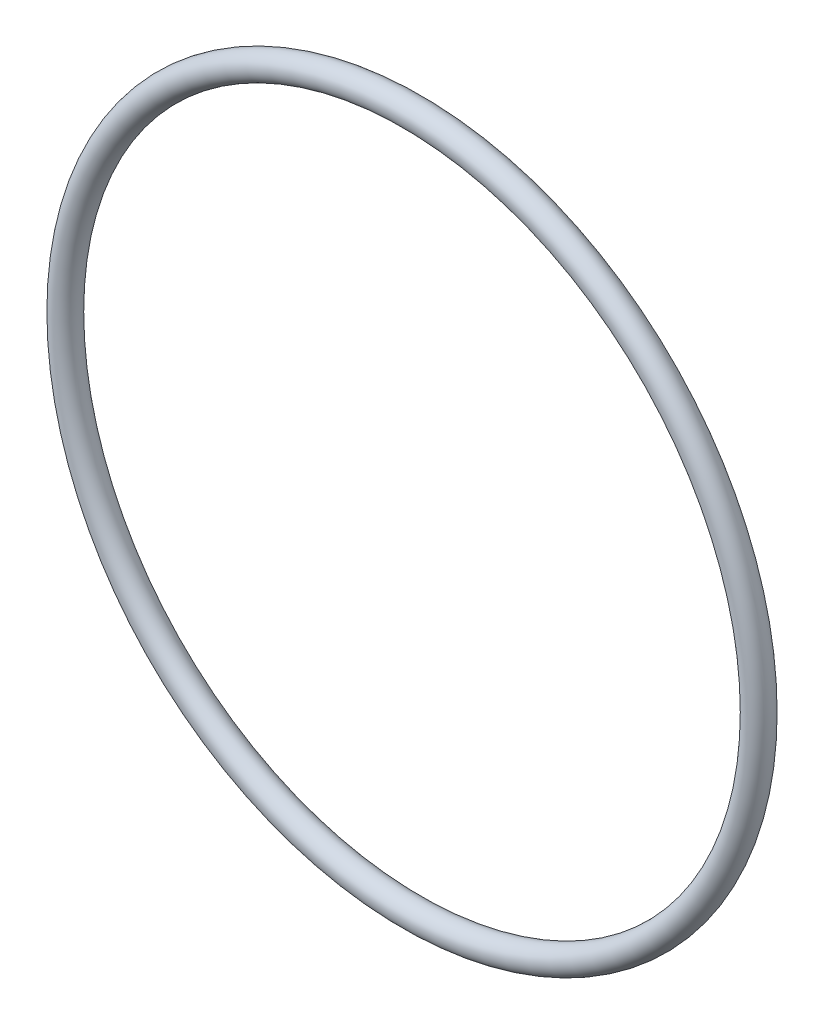
ISO-10303-21;
HEADER;
FILE_DESCRIPTION(('STEP AP214'),'2;1');
FILE_NAME('part.step','',(''),(''),'','','');
FILE_SCHEMA(('AUTOMOTIVE_DESIGN { 1 0 10303 214 1 1 1 1 }'));
ENDSEC;
DATA;
#1=APPLICATION_CONTEXT('core data for automotive mechanical design processes');
#2=APPLICATION_PROTOCOL_DEFINITION('international standard','automotive_design',2000,#1);
#3=PRODUCT_CONTEXT('',#1,'mechanical');
#4=PRODUCT('Part','Part','',(#3));
#5=PRODUCT_RELATED_PRODUCT_CATEGORY('part','',(#4));
#6=PRODUCT_DEFINITION_FORMATION('','',#4);
#7=PRODUCT_DEFINITION_CONTEXT('part definition',#1,'design');
#8=PRODUCT_DEFINITION('design','',#6,#7);
#9=PRODUCT_DEFINITION_SHAPE('','',#8);
#10=(LENGTH_UNIT() NAMED_UNIT(*) SI_UNIT(.MILLI.,.METRE.));
#11=(NAMED_UNIT(*) PLANE_ANGLE_UNIT() SI_UNIT($,.RADIAN.));
#12=(NAMED_UNIT(*) SI_UNIT($,.STERADIAN.) SOLID_ANGLE_UNIT());
#13=UNCERTAINTY_MEASURE_WITH_UNIT(LENGTH_MEASURE(1.E-05),#10,'distance_accuracy_value','');
#14=(GEOMETRIC_REPRESENTATION_CONTEXT(3) GLOBAL_UNCERTAINTY_ASSIGNED_CONTEXT((#13)) GLOBAL_UNIT_ASSIGNED_CONTEXT((#10,
#11,#12)) REPRESENTATION_CONTEXT('',''));
#15=CARTESIAN_POINT('',(0.,0.,0.));
#16=DIRECTION('',(0.,0.,1.));
#17=DIRECTION('',(1.,0.,0.));
#18=AXIS2_PLACEMENT_3D('',#15,#16,#17);
#19=CARTESIAN_POINT('',(0.,0.,0.));
#20=DIRECTION('',(0.,0.,1.));
#21=DIRECTION('',(1.,0.,0.));
#22=AXIS2_PLACEMENT_3D('',#19,#20,#21);
#23=TOROIDAL_SURFACE('',#22,33.25,1.25);
#24=CARTESIAN_POINT('',(34.5,0.,0.));
#25=VERTEX_POINT('',#24);
#26=VERTEX_LOOP('',#25);
#27=FACE_BOUND('',#26,.T.);
#28=ADVANCED_FACE('F37',(#27),#23,.T.);
#29=CLOSED_SHELL('',(#28));
#30=MANIFOLD_SOLID_BREP('B2',#29);
#31=ADVANCED_BREP_SHAPE_REPRESENTATION('',(#18,#30),#14);
#32=SHAPE_DEFINITION_REPRESENTATION(#9,#31);
ENDSEC;
END-ISO-10303-21;
